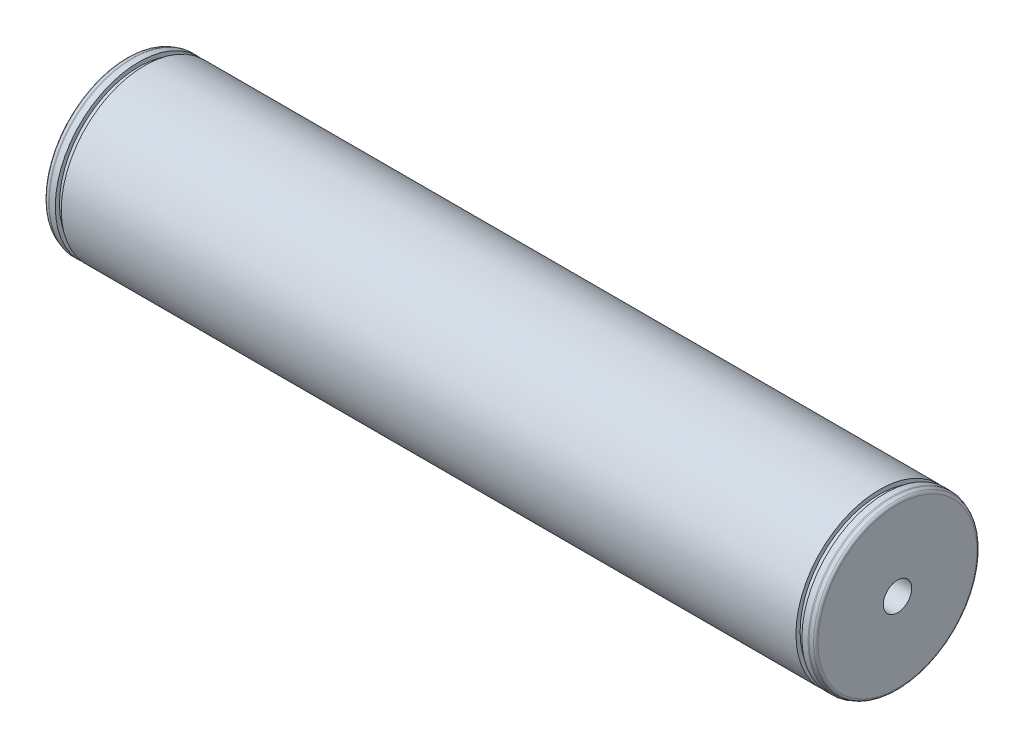
ISO-10303-21;
HEADER;
FILE_DESCRIPTION(('STEP AP214'),'2;1');
FILE_NAME('part.step','',(''),(''),'','','');
FILE_SCHEMA(('AUTOMOTIVE_DESIGN { 1 0 10303 214 1 1 1 1 }'));
ENDSEC;
DATA;
#1=APPLICATION_CONTEXT('core data for automotive mechanical design processes');
#2=APPLICATION_PROTOCOL_DEFINITION('international standard','automotive_design',2000,#1);
#3=PRODUCT_CONTEXT('',#1,'mechanical');
#4=PRODUCT('Part','Part','',(#3));
#5=PRODUCT_RELATED_PRODUCT_CATEGORY('part','',(#4));
#6=PRODUCT_DEFINITION_FORMATION('','',#4);
#7=PRODUCT_DEFINITION_CONTEXT('part definition',#1,'design');
#8=PRODUCT_DEFINITION('design','',#6,#7);
#9=PRODUCT_DEFINITION_SHAPE('','',#8);
#10=(LENGTH_UNIT() NAMED_UNIT(*) SI_UNIT(.MILLI.,.METRE.));
#11=(NAMED_UNIT(*) PLANE_ANGLE_UNIT() SI_UNIT($,.RADIAN.));
#12=(NAMED_UNIT(*) SI_UNIT($,.STERADIAN.) SOLID_ANGLE_UNIT());
#13=UNCERTAINTY_MEASURE_WITH_UNIT(LENGTH_MEASURE(1.E-05),#10,'distance_accuracy_value','');
#14=(GEOMETRIC_REPRESENTATION_CONTEXT(3) GLOBAL_UNCERTAINTY_ASSIGNED_CONTEXT((#13)) GLOBAL_UNIT_ASSIGNED_CONTEXT((#10,
#11,#12)) REPRESENTATION_CONTEXT('',''));
#15=CARTESIAN_POINT('',(0.,0.,0.));
#16=DIRECTION('',(0.,0.,1.));
#17=DIRECTION('',(1.,0.,0.));
#18=AXIS2_PLACEMENT_3D('',#15,#16,#17);
#19=CARTESIAN_POINT('',(-138.5,28.5718519932578,0.));
#20=DIRECTION('',(1.,0.,0.));
#21=DIRECTION('',(0.,0.,-1.));
#22=AXIS2_PLACEMENT_3D('',#19,#20,#21);
#23=PLANE('',#22);
#24=CARTESIAN_POINT('',(-138.5,0.,0.));
#25=DIRECTION('',(-1.,0.,0.));
#26=DIRECTION('',(0.,0.,1.));
#27=AXIS2_PLACEMENT_3D('',#24,#25,#26);
#28=CIRCLE('',#27,28.5718519932578);
#29=CARTESIAN_POINT('',(-138.5,0.,28.5718519932578));
#30=VERTEX_POINT('',#29);
#31=EDGE_CURVE('E123',#30,#30,#28,.T.);
#32=ORIENTED_EDGE('',*,*,#31,.T.);
#33=EDGE_LOOP('',(#32));
#34=FACE_BOUND('',#33,.T.);
#35=ADVANCED_FACE('F55',(#34),#23,.F.);
#36=CARTESIAN_POINT('',(118.5,0.,0.));
#37=DIRECTION('',(1.,0.,0.));
#38=DIRECTION('',(0.,0.,-1.));
#39=AXIS2_PLACEMENT_3D('',#36,#37,#38);
#40=CONICAL_SURFACE('',#39,5.1,1.0471975511966);
#41=CARTESIAN_POINT('',(115.555513627133,0.,0.));
#42=VERTEX_POINT('',#41);
#43=VERTEX_LOOP('',#42);
#44=FACE_BOUND('',#43,.T.);
#45=CARTESIAN_POINT('',(118.5,0.,0.));
#46=DIRECTION('',(-1.,0.,0.));
#47=DIRECTION('',(0.,0.,1.));
#48=AXIS2_PLACEMENT_3D('',#45,#46,#47);
#49=CIRCLE('',#48,5.1);
#50=CARTESIAN_POINT('',(118.5,0.,5.1));
#51=VERTEX_POINT('',#50);
#52=EDGE_CURVE('E11',#51,#51,#49,.T.);
#53=ORIENTED_EDGE('',*,*,#52,.F.);
#54=EDGE_LOOP('',(#53));
#55=FACE_BOUND('',#54,.T.);
#56=ADVANCED_FACE('F64',(#44,#55),#40,.F.);
#57=CARTESIAN_POINT('',(-138.5,0.,0.));
#58=DIRECTION('',(-1.,0.,0.));
#59=DIRECTION('',(0.,0.,1.));
#60=AXIS2_PLACEMENT_3D('',#57,#58,#59);
#61=CYLINDRICAL_SURFACE('',#60,5.09999999999998);
#62=ORIENTED_EDGE('',*,*,#52,.T.);
#63=EDGE_LOOP('',(#62));
#64=FACE_BOUND('',#63,.T.);
#65=CARTESIAN_POINT('',(138.5,0.,0.));
#66=DIRECTION('',(-1.,0.,0.));
#67=DIRECTION('',(0.,0.,1.));
#68=AXIS2_PLACEMENT_3D('',#65,#66,#67);
#69=CIRCLE('',#68,5.09999999999997);
#70=CARTESIAN_POINT('',(138.5,0.,5.09999999999997));
#71=VERTEX_POINT('',#70);
#72=EDGE_CURVE('E61',#71,#71,#69,.T.);
#73=ORIENTED_EDGE('',*,*,#72,.F.);
#74=EDGE_LOOP('',(#73));
#75=FACE_BOUND('',#74,.T.);
#76=ADVANCED_FACE('F67',(#64,#75),#61,.F.);
#77=CARTESIAN_POINT('',(138.5,28.5718519932578,0.));
#78=DIRECTION('',(1.,0.,0.));
#79=DIRECTION('',(0.,0.,-1.));
#80=AXIS2_PLACEMENT_3D('',#77,#78,#79);
#81=PLANE('',#80);
#82=ORIENTED_EDGE('',*,*,#72,.T.);
#83=EDGE_LOOP('',(#82));
#84=FACE_BOUND('',#83,.T.);
#85=CARTESIAN_POINT('',(138.5,0.,0.));
#86=DIRECTION('',(-1.,0.,0.));
#87=DIRECTION('',(0.,0.,1.));
#88=AXIS2_PLACEMENT_3D('',#85,#86,#87);
#89=CIRCLE('',#88,28.5718519932578);
#90=CARTESIAN_POINT('',(138.5,0.,28.5718519932578));
#91=VERTEX_POINT('',#90);
#92=EDGE_CURVE('E77',#91,#91,#89,.T.);
#93=ORIENTED_EDGE('',*,*,#92,.F.);
#94=EDGE_LOOP('',(#93));
#95=FACE_BOUND('',#94,.T.);
#96=ADVANCED_FACE('F72',(#84,#95),#81,.T.);
#97=CARTESIAN_POINT('',(137.5,0.,0.));
#98=DIRECTION('',(-1.,0.,0.));
#99=DIRECTION('',(0.,0.,1.));
#100=AXIS2_PLACEMENT_3D('',#97,#98,#99);
#101=TOROIDAL_SURFACE('',#100,28.5718519932578,1.);
#102=CARTESIAN_POINT('',(137.842020143326,0.,0.));
#103=DIRECTION('',(-1.,0.,0.));
#104=DIRECTION('',(0.,0.,1.));
#105=AXIS2_PLACEMENT_3D('',#102,#103,#104);
#106=CIRCLE('',#105,29.5115446140437);
#107=CARTESIAN_POINT('',(137.842020143326,0.,29.5115446140437));
#108=VERTEX_POINT('',#107);
#109=EDGE_CURVE('E79',#108,#108,#106,.T.);
#110=ORIENTED_EDGE('',*,*,#109,.F.);
#111=EDGE_LOOP('',(#110));
#112=FACE_BOUND('',#111,.T.);
#113=ORIENTED_EDGE('',*,*,#92,.T.);
#114=EDGE_LOOP('',(#113));
#115=FACE_BOUND('',#114,.T.);
#116=ADVANCED_FACE('F160',(#112,#115),#101,.T.);
#117=CARTESIAN_POINT('',(137.842020143326,0.,0.));
#118=DIRECTION('',(-1.,0.,0.));
#119=DIRECTION('',(0.,0.,1.));
#120=AXIS2_PLACEMENT_3D('',#117,#118,#119);
#121=CONICAL_SURFACE('',#120,29.5115446140437,0.349065850398852);
#122=CARTESIAN_POINT('',(136.665693162617,0.,0.));
#123=DIRECTION('',(-1.,0.,0.));
#124=DIRECTION('',(0.,0.,1.));
#125=AXIS2_PLACEMENT_3D('',#122,#123,#124);
#126=CIRCLE('',#125,29.9396926207858);
#127=CARTESIAN_POINT('',(136.665693162617,0.,29.9396926207858));
#128=VERTEX_POINT('',#127);
#129=EDGE_CURVE('E84',#128,#128,#126,.T.);
#130=ORIENTED_EDGE('',*,*,#129,.F.);
#131=EDGE_LOOP('',(#130));
#132=FACE_BOUND('',#131,.T.);
#133=ORIENTED_EDGE('',*,*,#109,.T.);
#134=EDGE_LOOP('',(#133));
#135=FACE_BOUND('',#134,.T.);
#136=ADVANCED_FACE('F167',(#132,#135),#121,.T.);
#137=CARTESIAN_POINT('',(136.323673019292,0.,0.));
#138=DIRECTION('',(-1.,0.,0.));
#139=DIRECTION('',(0.,0.,1.));
#140=AXIS2_PLACEMENT_3D('',#137,#138,#139);
#141=TOROIDAL_SURFACE('',#140,28.9999999999999,1.);
#142=ORIENTED_EDGE('',*,*,#129,.T.);
#143=EDGE_LOOP('',(#142));
#144=FACE_BOUND('',#143,.T.);
#145=CARTESIAN_POINT('',(136.323673019292,0.,0.));
#146=DIRECTION('',(-1.,0.,0.));
#147=DIRECTION('',(0.,0.,1.));
#148=AXIS2_PLACEMENT_3D('',#145,#146,#147);
#149=CIRCLE('',#148,29.9999999999999);
#150=CARTESIAN_POINT('',(136.323673019292,0.,29.9999999999999));
#151=VERTEX_POINT('',#150);
#152=EDGE_CURVE('E87',#151,#151,#149,.T.);
#153=ORIENTED_EDGE('',*,*,#152,.F.);
#154=EDGE_LOOP('',(#153));
#155=FACE_BOUND('',#154,.T.);
#156=ADVANCED_FACE('F175',(#144,#155),#141,.T.);
#157=CARTESIAN_POINT('',(-138.5,0.,0.));
#158=DIRECTION('',(-1.,0.,0.));
#159=DIRECTION('',(0.,0.,1.));
#160=AXIS2_PLACEMENT_3D('',#157,#158,#159);
#161=CYLINDRICAL_SURFACE('',#160,29.9999999999999);
#162=ORIENTED_EDGE('',*,*,#152,.T.);
#163=EDGE_LOOP('',(#162));
#164=FACE_BOUND('',#163,.T.);
#165=CARTESIAN_POINT('',(134.15,0.,0.));
#166=DIRECTION('',(-1.,0.,0.));
#167=DIRECTION('',(0.,0.,1.));
#168=AXIS2_PLACEMENT_3D('',#165,#166,#167);
#169=CIRCLE('',#168,29.9999999999999);
#170=CARTESIAN_POINT('',(134.15,0.,29.9999999999999));
#171=VERTEX_POINT('',#170);
#172=EDGE_CURVE('E90',#171,#171,#169,.T.);
#173=ORIENTED_EDGE('',*,*,#172,.F.);
#174=EDGE_LOOP('',(#173));
#175=FACE_BOUND('',#174,.T.);
#176=ADVANCED_FACE('F183',(#164,#175),#161,.T.);
#177=CARTESIAN_POINT('',(134.15,28.5000000000001,0.));
#178=DIRECTION('',(-1.,0.,0.));
#179=DIRECTION('',(0.,0.,1.));
#180=AXIS2_PLACEMENT_3D('',#177,#178,#179);
#181=PLANE('',#180);
#182=ORIENTED_EDGE('',*,*,#172,.T.);
#183=EDGE_LOOP('',(#182));
#184=FACE_BOUND('',#183,.T.);
#185=CARTESIAN_POINT('',(134.15,0.,0.));
#186=DIRECTION('',(-1.,0.,0.));
#187=DIRECTION('',(0.,0.,1.));
#188=AXIS2_PLACEMENT_3D('',#185,#186,#187);
#189=CIRCLE('',#188,28.5000000000001);
#190=CARTESIAN_POINT('',(134.15,0.,28.5000000000001));
#191=VERTEX_POINT('',#190);
#192=EDGE_CURVE('E93',#191,#191,#189,.T.);
#193=ORIENTED_EDGE('',*,*,#192,.F.);
#194=EDGE_LOOP('',(#193));
#195=FACE_BOUND('',#194,.T.);
#196=ADVANCED_FACE('F191',(#184,#195),#181,.T.);
#197=CARTESIAN_POINT('',(-138.5,0.,0.));
#198=DIRECTION('',(-1.,0.,0.));
#199=DIRECTION('',(0.,0.,1.));
#200=AXIS2_PLACEMENT_3D('',#197,#198,#199);
#201=CYLINDRICAL_SURFACE('',#200,28.5000000000001);
#202=ORIENTED_EDGE('',*,*,#192,.T.);
#203=EDGE_LOOP('',(#202));
#204=FACE_BOUND('',#203,.T.);
#205=CARTESIAN_POINT('',(132.,0.,0.));
#206=DIRECTION('',(-1.,0.,0.));
#207=DIRECTION('',(0.,0.,1.));
#208=AXIS2_PLACEMENT_3D('',#205,#206,#207);
#209=CIRCLE('',#208,28.5000000000001);
#210=CARTESIAN_POINT('',(132.,0.,28.5000000000001));
#211=VERTEX_POINT('',#210);
#212=EDGE_CURVE('E96',#211,#211,#209,.T.);
#213=ORIENTED_EDGE('',*,*,#212,.F.);
#214=EDGE_LOOP('',(#213));
#215=FACE_BOUND('',#214,.T.);
#216=ADVANCED_FACE('F199',(#204,#215),#201,.T.);
#217=CARTESIAN_POINT('',(132.,29.9999999999999,0.));
#218=DIRECTION('',(1.,0.,0.));
#219=DIRECTION('',(0.,0.,-1.));
#220=AXIS2_PLACEMENT_3D('',#217,#218,#219);
#221=PLANE('',#220);
#222=ORIENTED_EDGE('',*,*,#212,.T.);
#223=EDGE_LOOP('',(#222));
#224=FACE_BOUND('',#223,.T.);
#225=CARTESIAN_POINT('',(132.,0.,0.));
#226=DIRECTION('',(-1.,0.,0.));
#227=DIRECTION('',(0.,0.,1.));
#228=AXIS2_PLACEMENT_3D('',#225,#226,#227);
#229=CIRCLE('',#228,29.9999999999999);
#230=CARTESIAN_POINT('',(132.,0.,29.9999999999999));
#231=VERTEX_POINT('',#230);
#232=EDGE_CURVE('E99',#231,#231,#229,.T.);
#233=ORIENTED_EDGE('',*,*,#232,.F.);
#234=EDGE_LOOP('',(#233));
#235=FACE_BOUND('',#234,.T.);
#236=ADVANCED_FACE('F207',(#224,#235),#221,.T.);
#237=CARTESIAN_POINT('',(-138.5,0.,0.));
#238=DIRECTION('',(-1.,0.,0.));
#239=DIRECTION('',(0.,0.,1.));
#240=AXIS2_PLACEMENT_3D('',#237,#238,#239);
#241=CYLINDRICAL_SURFACE('',#240,29.9999999999999);
#242=CARTESIAN_POINT('',(-132.,0.,0.));
#243=DIRECTION('',(-1.,0.,0.));
#244=DIRECTION('',(0.,0.,1.));
#245=AXIS2_PLACEMENT_3D('',#242,#243,#244);
#246=CIRCLE('',#245,29.9999999999999);
#247=CARTESIAN_POINT('',(-132.,0.,29.9999999999999));
#248=VERTEX_POINT('',#247);
#249=EDGE_CURVE('E102',#248,#248,#246,.T.);
#250=ORIENTED_EDGE('',*,*,#249,.F.);
#251=EDGE_LOOP('',(#250));
#252=FACE_BOUND('',#251,.T.);
#253=ORIENTED_EDGE('',*,*,#232,.T.);
#254=EDGE_LOOP('',(#253));
#255=FACE_BOUND('',#254,.T.);
#256=ADVANCED_FACE('F215',(#252,#255),#241,.T.);
#257=CARTESIAN_POINT('',(-132.,29.9999999999999,0.));
#258=DIRECTION('',(1.,0.,0.));
#259=DIRECTION('',(0.,0.,-1.));
#260=AXIS2_PLACEMENT_3D('',#257,#258,#259);
#261=PLANE('',#260);
#262=CARTESIAN_POINT('',(-132.,0.,0.));
#263=DIRECTION('',(-1.,0.,0.));
#264=DIRECTION('',(0.,0.,1.));
#265=AXIS2_PLACEMENT_3D('',#262,#263,#264);
#266=CIRCLE('',#265,28.5000000000001);
#267=CARTESIAN_POINT('',(-132.,0.,28.5000000000001));
#268=VERTEX_POINT('',#267);
#269=EDGE_CURVE('E105',#268,#268,#266,.T.);
#270=ORIENTED_EDGE('',*,*,#269,.F.);
#271=EDGE_LOOP('',(#270));
#272=FACE_BOUND('',#271,.T.);
#273=ORIENTED_EDGE('',*,*,#249,.T.);
#274=EDGE_LOOP('',(#273));
#275=FACE_BOUND('',#274,.T.);
#276=ADVANCED_FACE('F224',(#272,#275),#261,.F.);
#277=CARTESIAN_POINT('',(-138.5,0.,0.));
#278=DIRECTION('',(-1.,0.,0.));
#279=DIRECTION('',(0.,0.,1.));
#280=AXIS2_PLACEMENT_3D('',#277,#278,#279);
#281=CYLINDRICAL_SURFACE('',#280,28.5000000000001);
#282=CARTESIAN_POINT('',(-134.15,0.,0.));
#283=DIRECTION('',(-1.,0.,0.));
#284=DIRECTION('',(0.,0.,1.));
#285=AXIS2_PLACEMENT_3D('',#282,#283,#284);
#286=CIRCLE('',#285,28.5000000000001);
#287=CARTESIAN_POINT('',(-134.15,0.,28.5000000000001));
#288=VERTEX_POINT('',#287);
#289=EDGE_CURVE('E108',#288,#288,#286,.T.);
#290=ORIENTED_EDGE('',*,*,#289,.F.);
#291=EDGE_LOOP('',(#290));
#292=FACE_BOUND('',#291,.T.);
#293=ORIENTED_EDGE('',*,*,#269,.T.);
#294=EDGE_LOOP('',(#293));
#295=FACE_BOUND('',#294,.T.);
#296=ADVANCED_FACE('F232',(#292,#295),#281,.T.);
#297=CARTESIAN_POINT('',(-134.15,28.5000000000001,0.));
#298=DIRECTION('',(-1.,0.,0.));
#299=DIRECTION('',(0.,0.,1.));
#300=AXIS2_PLACEMENT_3D('',#297,#298,#299);
#301=PLANE('',#300);
#302=CARTESIAN_POINT('',(-134.15,0.,0.));
#303=DIRECTION('',(-1.,0.,0.));
#304=DIRECTION('',(0.,0.,1.));
#305=AXIS2_PLACEMENT_3D('',#302,#303,#304);
#306=CIRCLE('',#305,29.9999999999999);
#307=CARTESIAN_POINT('',(-134.15,0.,29.9999999999999));
#308=VERTEX_POINT('',#307);
#309=EDGE_CURVE('E111',#308,#308,#306,.T.);
#310=ORIENTED_EDGE('',*,*,#309,.F.);
#311=EDGE_LOOP('',(#310));
#312=FACE_BOUND('',#311,.T.);
#313=ORIENTED_EDGE('',*,*,#289,.T.);
#314=EDGE_LOOP('',(#313));
#315=FACE_BOUND('',#314,.T.);
#316=ADVANCED_FACE('F240',(#312,#315),#301,.F.);
#317=CARTESIAN_POINT('',(-138.5,0.,0.));
#318=DIRECTION('',(-1.,0.,0.));
#319=DIRECTION('',(0.,0.,1.));
#320=AXIS2_PLACEMENT_3D('',#317,#318,#319);
#321=CYLINDRICAL_SURFACE('',#320,29.9999999999999);
#322=CARTESIAN_POINT('',(-136.323673019292,0.,0.));
#323=DIRECTION('',(-1.,0.,0.));
#324=DIRECTION('',(0.,0.,1.));
#325=AXIS2_PLACEMENT_3D('',#322,#323,#324);
#326=CIRCLE('',#325,29.9999999999999);
#327=CARTESIAN_POINT('',(-136.323673019292,0.,29.9999999999999));
#328=VERTEX_POINT('',#327);
#329=EDGE_CURVE('E114',#328,#328,#326,.T.);
#330=ORIENTED_EDGE('',*,*,#329,.F.);
#331=EDGE_LOOP('',(#330));
#332=FACE_BOUND('',#331,.T.);
#333=ORIENTED_EDGE('',*,*,#309,.T.);
#334=EDGE_LOOP('',(#333));
#335=FACE_BOUND('',#334,.T.);
#336=ADVANCED_FACE('F248',(#332,#335),#321,.T.);
#337=CARTESIAN_POINT('',(-136.323673019292,0.,0.));
#338=DIRECTION('',(-1.,0.,0.));
#339=DIRECTION('',(0.,0.,1.));
#340=AXIS2_PLACEMENT_3D('',#337,#338,#339);
#341=TOROIDAL_SURFACE('',#340,28.9999999999999,1.);
#342=CARTESIAN_POINT('',(-136.665693162617,0.,0.));
#343=DIRECTION('',(-1.,0.,0.));
#344=DIRECTION('',(0.,0.,1.));
#345=AXIS2_PLACEMENT_3D('',#342,#343,#344);
#346=CIRCLE('',#345,29.9396926207858);
#347=CARTESIAN_POINT('',(-136.665693162617,0.,29.9396926207858));
#348=VERTEX_POINT('',#347);
#349=EDGE_CURVE('E117',#348,#348,#346,.T.);
#350=ORIENTED_EDGE('',*,*,#349,.F.);
#351=EDGE_LOOP('',(#350));
#352=FACE_BOUND('',#351,.T.);
#353=ORIENTED_EDGE('',*,*,#329,.T.);
#354=EDGE_LOOP('',(#353));
#355=FACE_BOUND('',#354,.T.);
#356=ADVANCED_FACE('F136',(#352,#355),#341,.T.);
#357=CARTESIAN_POINT('',(-137.842020143326,0.,0.));
#358=DIRECTION('',(1.,0.,0.));
#359=DIRECTION('',(0.,0.,-1.));
#360=AXIS2_PLACEMENT_3D('',#357,#358,#359);
#361=CONICAL_SURFACE('',#360,29.5115446140437,0.349065850398855);
#362=ORIENTED_EDGE('',*,*,#349,.T.);
#363=EDGE_LOOP('',(#362));
#364=FACE_BOUND('',#363,.T.);
#365=CARTESIAN_POINT('',(-137.842020143326,0.,0.));
#366=DIRECTION('',(-1.,0.,0.));
#367=DIRECTION('',(0.,0.,1.));
#368=AXIS2_PLACEMENT_3D('',#365,#366,#367);
#369=CIRCLE('',#368,29.5115446140437);
#370=CARTESIAN_POINT('',(-137.842020143326,0.,29.5115446140437));
#371=VERTEX_POINT('',#370);
#372=EDGE_CURVE('E120',#371,#371,#369,.T.);
#373=ORIENTED_EDGE('',*,*,#372,.F.);
#374=EDGE_LOOP('',(#373));
#375=FACE_BOUND('',#374,.T.);
#376=ADVANCED_FACE('F130',(#364,#375),#361,.T.);
#377=CARTESIAN_POINT('',(-137.5,0.,0.));
#378=DIRECTION('',(-1.,0.,0.));
#379=DIRECTION('',(0.,0.,1.));
#380=AXIS2_PLACEMENT_3D('',#377,#378,#379);
#381=TOROIDAL_SURFACE('',#380,28.5718519932578,1.);
#382=ORIENTED_EDGE('',*,*,#372,.T.);
#383=EDGE_LOOP('',(#382));
#384=FACE_BOUND('',#383,.T.);
#385=ORIENTED_EDGE('',*,*,#31,.F.);
#386=EDGE_LOOP('',(#385));
#387=FACE_BOUND('',#386,.T.);
#388=ADVANCED_FACE('F128',(#384,#387),#381,.T.);
#389=CLOSED_SHELL('',(#35,#56,#76,#96,#116,#136,#156,#176,#196,#216,#236,#256,#276,#296,#316,
#336,#356,#376,#388));
#390=MANIFOLD_SOLID_BREP('B2',#389);
#391=ADVANCED_BREP_SHAPE_REPRESENTATION('',(#18,#390),#14);
#392=SHAPE_DEFINITION_REPRESENTATION(#9,#391);
ENDSEC;
END-ISO-10303-21;
